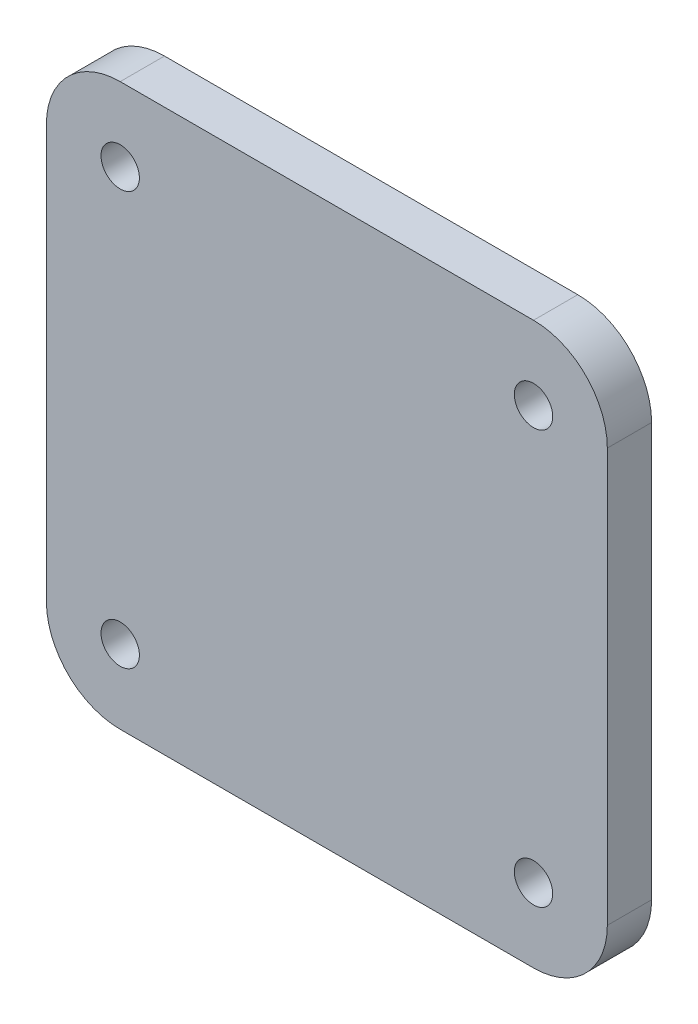
ISO-10303-21;
HEADER;
FILE_DESCRIPTION(('STEP AP214'),'2;1');
FILE_NAME('part.step','',(''),(''),'','','');
FILE_SCHEMA(('AUTOMOTIVE_DESIGN { 1 0 10303 214 1 1 1 1 }'));
ENDSEC;
DATA;
#1=APPLICATION_CONTEXT('core data for automotive mechanical design processes');
#2=APPLICATION_PROTOCOL_DEFINITION('international standard','automotive_design',2000,#1);
#3=PRODUCT_CONTEXT('',#1,'mechanical');
#4=PRODUCT('Part','Part','',(#3));
#5=PRODUCT_RELATED_PRODUCT_CATEGORY('part','',(#4));
#6=PRODUCT_DEFINITION_FORMATION('','',#4);
#7=PRODUCT_DEFINITION_CONTEXT('part definition',#1,'design');
#8=PRODUCT_DEFINITION('design','',#6,#7);
#9=PRODUCT_DEFINITION_SHAPE('','',#8);
#10=(LENGTH_UNIT() NAMED_UNIT(*) SI_UNIT(.MILLI.,.METRE.));
#11=(NAMED_UNIT(*) PLANE_ANGLE_UNIT() SI_UNIT($,.RADIAN.));
#12=(NAMED_UNIT(*) SI_UNIT($,.STERADIAN.) SOLID_ANGLE_UNIT());
#13=UNCERTAINTY_MEASURE_WITH_UNIT(LENGTH_MEASURE(1.E-05),#10,'distance_accuracy_value','');
#14=(GEOMETRIC_REPRESENTATION_CONTEXT(3) GLOBAL_UNCERTAINTY_ASSIGNED_CONTEXT((#13)) GLOBAL_UNIT_ASSIGNED_CONTEXT((#10,
#11,#12)) REPRESENTATION_CONTEXT('',''));
#15=CARTESIAN_POINT('',(0.,0.,0.));
#16=DIRECTION('',(0.,0.,1.));
#17=DIRECTION('',(1.,0.,0.));
#18=AXIS2_PLACEMENT_3D('',#15,#16,#17);
#19=CARTESIAN_POINT('',(0.,0.,3.));
#20=DIRECTION('',(0.,0.,1.));
#21=DIRECTION('',(1.,0.,0.));
#22=AXIS2_PLACEMENT_3D('',#19,#20,#21);
#23=PLANE('',#22);
#24=CARTESIAN_POINT('',(14.,14.,3.));
#25=DIRECTION('',(0.,0.,1.));
#26=DIRECTION('',(1.,0.,0.));
#27=AXIS2_PLACEMENT_3D('',#24,#25,#26);
#28=CIRCLE('',#27,1.3);
#29=CARTESIAN_POINT('',(15.3,14.,3.));
#30=VERTEX_POINT('',#29);
#31=EDGE_CURVE('E188',#30,#30,#28,.T.);
#32=ORIENTED_EDGE('',*,*,#31,.F.);
#33=EDGE_LOOP('',(#32));
#34=FACE_BOUND('',#33,.T.);
#35=CARTESIAN_POINT('',(-14.,-14.,3.));
#36=DIRECTION('',(0.,0.,1.));
#37=DIRECTION('',(1.,0.,0.));
#38=AXIS2_PLACEMENT_3D('',#35,#36,#37);
#39=CIRCLE('',#38,1.3);
#40=CARTESIAN_POINT('',(-12.7,-14.,3.));
#41=VERTEX_POINT('',#40);
#42=EDGE_CURVE('E129',#41,#41,#39,.T.);
#43=ORIENTED_EDGE('',*,*,#42,.F.);
#44=EDGE_LOOP('',(#43));
#45=FACE_BOUND('',#44,.T.);
#46=DIRECTION('',(1.,0.,0.));
#47=VECTOR('',#46,1.);
#48=CARTESIAN_POINT('',(-19.,-19.,3.));
#49=LINE('',#48,#47);
#50=CARTESIAN_POINT('',(-14.,-19.,3.));
#51=VERTEX_POINT('',#50);
#52=CARTESIAN_POINT('',(14.,-19.,3.));
#53=VERTEX_POINT('',#52);
#54=EDGE_CURVE('E138',#51,#53,#49,.T.);
#55=ORIENTED_EDGE('',*,*,#54,.T.);
#56=CARTESIAN_POINT('',(14.,-14.,3.));
#57=DIRECTION('',(0.,0.,1.));
#58=DIRECTION('',(1.,0.,0.));
#59=AXIS2_PLACEMENT_3D('',#56,#57,#58);
#60=CIRCLE('',#59,5.);
#61=CARTESIAN_POINT('',(19.,-14.,3.));
#62=VERTEX_POINT('',#61);
#63=EDGE_CURVE('E157',#53,#62,#60,.T.);
#64=ORIENTED_EDGE('',*,*,#63,.T.);
#65=DIRECTION('',(0.,1.,0.));
#66=VECTOR('',#65,1.);
#67=CARTESIAN_POINT('',(19.,19.,3.));
#68=LINE('',#67,#66);
#69=CARTESIAN_POINT('',(19.,14.,3.));
#70=VERTEX_POINT('',#69);
#71=EDGE_CURVE('E121',#62,#70,#68,.T.);
#72=ORIENTED_EDGE('',*,*,#71,.T.);
#73=CARTESIAN_POINT('',(14.,14.,3.));
#74=DIRECTION('',(0.,0.,1.));
#75=DIRECTION('',(1.,0.,0.));
#76=AXIS2_PLACEMENT_3D('',#73,#74,#75);
#77=CIRCLE('',#76,5.);
#78=CARTESIAN_POINT('',(14.,19.,3.));
#79=VERTEX_POINT('',#78);
#80=EDGE_CURVE('E152',#70,#79,#77,.T.);
#81=ORIENTED_EDGE('',*,*,#80,.T.);
#82=DIRECTION('',(-1.,0.,0.));
#83=VECTOR('',#82,1.);
#84=CARTESIAN_POINT('',(-19.,19.,3.));
#85=LINE('',#84,#83);
#86=CARTESIAN_POINT('',(-14.,19.,3.));
#87=VERTEX_POINT('',#86);
#88=EDGE_CURVE('E168',#79,#87,#85,.T.);
#89=ORIENTED_EDGE('',*,*,#88,.T.);
#90=CARTESIAN_POINT('',(-14.,14.,3.));
#91=DIRECTION('',(0.,0.,1.));
#92=DIRECTION('',(1.,0.,0.));
#93=AXIS2_PLACEMENT_3D('',#90,#91,#92);
#94=CIRCLE('',#93,5.);
#95=CARTESIAN_POINT('',(-19.,14.,3.));
#96=VERTEX_POINT('',#95);
#97=EDGE_CURVE('E57',#87,#96,#94,.T.);
#98=ORIENTED_EDGE('',*,*,#97,.T.);
#99=DIRECTION('',(0.,-1.,0.));
#100=VECTOR('',#99,1.);
#101=CARTESIAN_POINT('',(-19.,19.,3.));
#102=LINE('',#101,#100);
#103=CARTESIAN_POINT('',(-19.,-14.,3.));
#104=VERTEX_POINT('',#103);
#105=EDGE_CURVE('E176',#96,#104,#102,.T.);
#106=ORIENTED_EDGE('',*,*,#105,.T.);
#107=CARTESIAN_POINT('',(-14.,-14.,3.));
#108=DIRECTION('',(0.,0.,1.));
#109=DIRECTION('',(1.,0.,0.));
#110=AXIS2_PLACEMENT_3D('',#107,#108,#109);
#111=CIRCLE('',#110,5.);
#112=EDGE_CURVE('E155',#104,#51,#111,.T.);
#113=ORIENTED_EDGE('',*,*,#112,.T.);
#114=EDGE_LOOP('',(#55,#64,#72,#81,#89,#98,#106,#113));
#115=FACE_BOUND('',#114,.T.);
#116=CARTESIAN_POINT('',(14.,-14.,3.));
#117=DIRECTION('',(0.,0.,1.));
#118=DIRECTION('',(1.,0.,0.));
#119=AXIS2_PLACEMENT_3D('',#116,#117,#118);
#120=CIRCLE('',#119,1.3);
#121=CARTESIAN_POINT('',(15.3,-14.,3.));
#122=VERTEX_POINT('',#121);
#123=EDGE_CURVE('E183',#122,#122,#120,.T.);
#124=ORIENTED_EDGE('',*,*,#123,.F.);
#125=EDGE_LOOP('',(#124));
#126=FACE_BOUND('',#125,.T.);
#127=CARTESIAN_POINT('',(-14.,14.,3.));
#128=DIRECTION('',(0.,0.,1.));
#129=DIRECTION('',(1.,0.,0.));
#130=AXIS2_PLACEMENT_3D('',#127,#128,#129);
#131=CIRCLE('',#130,1.3);
#132=CARTESIAN_POINT('',(-12.7,14.,3.));
#133=VERTEX_POINT('',#132);
#134=EDGE_CURVE('E194',#133,#133,#131,.T.);
#135=ORIENTED_EDGE('',*,*,#134,.F.);
#136=EDGE_LOOP('',(#135));
#137=FACE_BOUND('',#136,.T.);
#138=ADVANCED_FACE('F35',(#34,#45,#115,#126,#137),#23,.T.);
#139=CARTESIAN_POINT('',(0.,0.,0.));
#140=DIRECTION('',(0.,0.,1.));
#141=DIRECTION('',(1.,0.,0.));
#142=AXIS2_PLACEMENT_3D('',#139,#140,#141);
#143=PLANE('',#142);
#144=DIRECTION('',(0.,1.,0.));
#145=VECTOR('',#144,1.);
#146=CARTESIAN_POINT('',(19.,19.,0.));
#147=LINE('',#146,#145);
#148=CARTESIAN_POINT('',(19.,-14.,0.));
#149=VERTEX_POINT('',#148);
#150=CARTESIAN_POINT('',(19.,14.,0.));
#151=VERTEX_POINT('',#150);
#152=EDGE_CURVE('E118',#149,#151,#147,.T.);
#153=ORIENTED_EDGE('',*,*,#152,.F.);
#154=CARTESIAN_POINT('',(14.,-14.,0.));
#155=DIRECTION('',(0.,0.,1.));
#156=DIRECTION('',(1.,0.,0.));
#157=AXIS2_PLACEMENT_3D('',#154,#155,#156);
#158=CIRCLE('',#157,5.);
#159=CARTESIAN_POINT('',(14.,-19.,0.));
#160=VERTEX_POINT('',#159);
#161=EDGE_CURVE('E101',#149,#160,#158,.F.);
#162=ORIENTED_EDGE('',*,*,#161,.T.);
#163=DIRECTION('',(1.,0.,0.));
#164=VECTOR('',#163,1.);
#165=CARTESIAN_POINT('',(-19.,-19.,0.));
#166=LINE('',#165,#164);
#167=CARTESIAN_POINT('',(-14.,-19.,0.));
#168=VERTEX_POINT('',#167);
#169=EDGE_CURVE('E142',#168,#160,#166,.T.);
#170=ORIENTED_EDGE('',*,*,#169,.F.);
#171=CARTESIAN_POINT('',(-14.,-14.,0.));
#172=DIRECTION('',(0.,0.,1.));
#173=DIRECTION('',(1.,0.,0.));
#174=AXIS2_PLACEMENT_3D('',#171,#172,#173);
#175=CIRCLE('',#174,5.);
#176=CARTESIAN_POINT('',(-19.,-14.,0.));
#177=VERTEX_POINT('',#176);
#178=EDGE_CURVE('E112',#168,#177,#175,.F.);
#179=ORIENTED_EDGE('',*,*,#178,.T.);
#180=DIRECTION('',(0.,-1.,0.));
#181=VECTOR('',#180,1.);
#182=CARTESIAN_POINT('',(-19.,19.,0.));
#183=LINE('',#182,#181);
#184=CARTESIAN_POINT('',(-19.,14.,0.));
#185=VERTEX_POINT('',#184);
#186=EDGE_CURVE('E132',#185,#177,#183,.T.);
#187=ORIENTED_EDGE('',*,*,#186,.F.);
#188=CARTESIAN_POINT('',(-14.,14.,0.));
#189=DIRECTION('',(0.,0.,1.));
#190=DIRECTION('',(1.,0.,0.));
#191=AXIS2_PLACEMENT_3D('',#188,#189,#190);
#192=CIRCLE('',#191,5.);
#193=CARTESIAN_POINT('',(-14.,19.,0.));
#194=VERTEX_POINT('',#193);
#195=EDGE_CURVE('E146',#185,#194,#192,.F.);
#196=ORIENTED_EDGE('',*,*,#195,.T.);
#197=DIRECTION('',(-1.,0.,0.));
#198=VECTOR('',#197,1.);
#199=CARTESIAN_POINT('',(-19.,19.,0.));
#200=LINE('',#199,#198);
#201=CARTESIAN_POINT('',(14.,19.,0.));
#202=VERTEX_POINT('',#201);
#203=EDGE_CURVE('E128',#202,#194,#200,.T.);
#204=ORIENTED_EDGE('',*,*,#203,.F.);
#205=CARTESIAN_POINT('',(14.,14.,0.));
#206=DIRECTION('',(0.,0.,1.));
#207=DIRECTION('',(1.,0.,0.));
#208=AXIS2_PLACEMENT_3D('',#205,#206,#207);
#209=CIRCLE('',#208,5.);
#210=EDGE_CURVE('E122',#202,#151,#209,.F.);
#211=ORIENTED_EDGE('',*,*,#210,.T.);
#212=EDGE_LOOP('',(#153,#162,#170,#179,#187,#196,#204,#211));
#213=FACE_BOUND('',#212,.T.);
#214=CARTESIAN_POINT('',(-14.,-14.,0.));
#215=DIRECTION('',(0.,0.,1.));
#216=DIRECTION('',(1.,0.,0.));
#217=AXIS2_PLACEMENT_3D('',#214,#215,#216);
#218=CIRCLE('',#217,1.3);
#219=CARTESIAN_POINT('',(-12.7,-14.,0.));
#220=VERTEX_POINT('',#219);
#221=EDGE_CURVE('E135',#220,#220,#218,.T.);
#222=ORIENTED_EDGE('',*,*,#221,.T.);
#223=EDGE_LOOP('',(#222));
#224=FACE_BOUND('',#223,.T.);
#225=CARTESIAN_POINT('',(14.,-14.,0.));
#226=DIRECTION('',(0.,0.,1.));
#227=DIRECTION('',(1.,0.,0.));
#228=AXIS2_PLACEMENT_3D('',#225,#226,#227);
#229=CIRCLE('',#228,1.3);
#230=CARTESIAN_POINT('',(15.3,-14.,0.));
#231=VERTEX_POINT('',#230);
#232=EDGE_CURVE('E185',#231,#231,#229,.T.);
#233=ORIENTED_EDGE('',*,*,#232,.T.);
#234=EDGE_LOOP('',(#233));
#235=FACE_BOUND('',#234,.T.);
#236=CARTESIAN_POINT('',(14.,14.,0.));
#237=DIRECTION('',(0.,0.,1.));
#238=DIRECTION('',(1.,0.,0.));
#239=AXIS2_PLACEMENT_3D('',#236,#237,#238);
#240=CIRCLE('',#239,1.3);
#241=CARTESIAN_POINT('',(15.3,14.,0.));
#242=VERTEX_POINT('',#241);
#243=EDGE_CURVE('E191',#242,#242,#240,.T.);
#244=ORIENTED_EDGE('',*,*,#243,.T.);
#245=EDGE_LOOP('',(#244));
#246=FACE_BOUND('',#245,.T.);
#247=CARTESIAN_POINT('',(-14.,14.,0.));
#248=DIRECTION('',(0.,0.,1.));
#249=DIRECTION('',(1.,0.,0.));
#250=AXIS2_PLACEMENT_3D('',#247,#248,#249);
#251=CIRCLE('',#250,1.3);
#252=CARTESIAN_POINT('',(-12.7,14.,0.));
#253=VERTEX_POINT('',#252);
#254=EDGE_CURVE('E197',#253,#253,#251,.T.);
#255=ORIENTED_EDGE('',*,*,#254,.T.);
#256=EDGE_LOOP('',(#255));
#257=FACE_BOUND('',#256,.T.);
#258=ADVANCED_FACE('F125',(#213,#224,#235,#246,#257),#143,.F.);
#259=CARTESIAN_POINT('',(19.,19.,3.));
#260=DIRECTION('',(-1.,0.,0.));
#261=DIRECTION('',(0.,0.,1.));
#262=AXIS2_PLACEMENT_3D('',#259,#260,#261);
#263=PLANE('',#262);
#264=ORIENTED_EDGE('',*,*,#71,.F.);
#265=DIRECTION('',(0.,0.,-1.));
#266=VECTOR('',#265,1.);
#267=CARTESIAN_POINT('',(19.,-14.,3.));
#268=LINE('',#267,#266);
#269=EDGE_CURVE('E105',#62,#149,#268,.T.);
#270=ORIENTED_EDGE('',*,*,#269,.T.);
#271=ORIENTED_EDGE('',*,*,#152,.T.);
#272=DIRECTION('',(0.,0.,-1.));
#273=VECTOR('',#272,1.);
#274=CARTESIAN_POINT('',(19.,14.,3.));
#275=LINE('',#274,#273);
#276=EDGE_CURVE('E123',#151,#70,#275,.F.);
#277=ORIENTED_EDGE('',*,*,#276,.T.);
#278=EDGE_LOOP('',(#264,#270,#271,#277));
#279=FACE_BOUND('',#278,.T.);
#280=ADVANCED_FACE('F117',(#279),#263,.F.);
#281=CARTESIAN_POINT('',(-19.,19.,3.));
#282=DIRECTION('',(0.,-1.,0.));
#283=DIRECTION('',(0.,0.,-1.));
#284=AXIS2_PLACEMENT_3D('',#281,#282,#283);
#285=PLANE('',#284);
#286=ORIENTED_EDGE('',*,*,#203,.T.);
#287=DIRECTION('',(0.,0.,-1.));
#288=VECTOR('',#287,1.);
#289=CARTESIAN_POINT('',(-14.,19.,3.));
#290=LINE('',#289,#288);
#291=EDGE_CURVE('E11',#194,#87,#290,.F.);
#292=ORIENTED_EDGE('',*,*,#291,.T.);
#293=ORIENTED_EDGE('',*,*,#88,.F.);
#294=DIRECTION('',(0.,0.,-1.));
#295=VECTOR('',#294,1.);
#296=CARTESIAN_POINT('',(14.,19.,3.));
#297=LINE('',#296,#295);
#298=EDGE_CURVE('E43',#79,#202,#297,.T.);
#299=ORIENTED_EDGE('',*,*,#298,.T.);
#300=EDGE_LOOP('',(#286,#292,#293,#299));
#301=FACE_BOUND('',#300,.T.);
#302=ADVANCED_FACE('F166',(#301),#285,.F.);
#303=CARTESIAN_POINT('',(-19.,19.,3.));
#304=DIRECTION('',(1.,0.,0.));
#305=DIRECTION('',(0.,0.,-1.));
#306=AXIS2_PLACEMENT_3D('',#303,#304,#305);
#307=PLANE('',#306);
#308=ORIENTED_EDGE('',*,*,#186,.T.);
#309=DIRECTION('',(0.,0.,-1.));
#310=VECTOR('',#309,1.);
#311=CARTESIAN_POINT('',(-19.,-14.,3.));
#312=LINE('',#311,#310);
#313=EDGE_CURVE('E50',#177,#104,#312,.F.);
#314=ORIENTED_EDGE('',*,*,#313,.T.);
#315=ORIENTED_EDGE('',*,*,#105,.F.);
#316=DIRECTION('',(0.,0.,-1.));
#317=VECTOR('',#316,1.);
#318=CARTESIAN_POINT('',(-19.,14.,3.));
#319=LINE('',#318,#317);
#320=EDGE_CURVE('E159',#96,#185,#319,.T.);
#321=ORIENTED_EDGE('',*,*,#320,.T.);
#322=EDGE_LOOP('',(#308,#314,#315,#321));
#323=FACE_BOUND('',#322,.T.);
#324=ADVANCED_FACE('F175',(#323),#307,.F.);
#325=CARTESIAN_POINT('',(-19.,-19.,3.));
#326=DIRECTION('',(0.,1.,0.));
#327=DIRECTION('',(0.,0.,1.));
#328=AXIS2_PLACEMENT_3D('',#325,#326,#327);
#329=PLANE('',#328);
#330=ORIENTED_EDGE('',*,*,#169,.T.);
#331=DIRECTION('',(0.,0.,-1.));
#332=VECTOR('',#331,1.);
#333=CARTESIAN_POINT('',(14.,-19.,3.));
#334=LINE('',#333,#332);
#335=EDGE_CURVE('E106',#160,#53,#334,.F.);
#336=ORIENTED_EDGE('',*,*,#335,.T.);
#337=ORIENTED_EDGE('',*,*,#54,.F.);
#338=DIRECTION('',(0.,0.,-1.));
#339=VECTOR('',#338,1.);
#340=CARTESIAN_POINT('',(-14.,-19.,3.));
#341=LINE('',#340,#339);
#342=EDGE_CURVE('E111',#51,#168,#341,.T.);
#343=ORIENTED_EDGE('',*,*,#342,.T.);
#344=EDGE_LOOP('',(#330,#336,#337,#343));
#345=FACE_BOUND('',#344,.T.);
#346=ADVANCED_FACE('F219',(#345),#329,.F.);
#347=CARTESIAN_POINT('',(-14.,-14.,3.));
#348=DIRECTION('',(0.,0.,-1.));
#349=DIRECTION('',(-1.,0.,0.));
#350=AXIS2_PLACEMENT_3D('',#347,#348,#349);
#351=CYLINDRICAL_SURFACE('',#350,1.3);
#352=ORIENTED_EDGE('',*,*,#42,.T.);
#353=EDGE_LOOP('',(#352));
#354=FACE_BOUND('',#353,.T.);
#355=ORIENTED_EDGE('',*,*,#221,.F.);
#356=EDGE_LOOP('',(#355));
#357=FACE_BOUND('',#356,.T.);
#358=ADVANCED_FACE('F216',(#354,#357),#351,.F.);
#359=CARTESIAN_POINT('',(14.,-14.,3.));
#360=DIRECTION('',(0.,0.,-1.));
#361=DIRECTION('',(-1.,0.,0.));
#362=AXIS2_PLACEMENT_3D('',#359,#360,#361);
#363=CYLINDRICAL_SURFACE('',#362,1.3);
#364=ORIENTED_EDGE('',*,*,#123,.T.);
#365=EDGE_LOOP('',(#364));
#366=FACE_BOUND('',#365,.T.);
#367=ORIENTED_EDGE('',*,*,#232,.F.);
#368=EDGE_LOOP('',(#367));
#369=FACE_BOUND('',#368,.T.);
#370=ADVANCED_FACE('F245',(#366,#369),#363,.F.);
#371=CARTESIAN_POINT('',(14.,14.,3.));
#372=DIRECTION('',(0.,0.,-1.));
#373=DIRECTION('',(-1.,0.,0.));
#374=AXIS2_PLACEMENT_3D('',#371,#372,#373);
#375=CYLINDRICAL_SURFACE('',#374,1.3);
#376=ORIENTED_EDGE('',*,*,#31,.T.);
#377=EDGE_LOOP('',(#376));
#378=FACE_BOUND('',#377,.T.);
#379=ORIENTED_EDGE('',*,*,#243,.F.);
#380=EDGE_LOOP('',(#379));
#381=FACE_BOUND('',#380,.T.);
#382=ADVANCED_FACE('F248',(#378,#381),#375,.F.);
#383=CARTESIAN_POINT('',(-14.,14.,3.));
#384=DIRECTION('',(0.,0.,-1.));
#385=DIRECTION('',(-1.,0.,0.));
#386=AXIS2_PLACEMENT_3D('',#383,#384,#385);
#387=CYLINDRICAL_SURFACE('',#386,1.3);
#388=ORIENTED_EDGE('',*,*,#134,.T.);
#389=EDGE_LOOP('',(#388));
#390=FACE_BOUND('',#389,.T.);
#391=ORIENTED_EDGE('',*,*,#254,.F.);
#392=EDGE_LOOP('',(#391));
#393=FACE_BOUND('',#392,.T.);
#394=ADVANCED_FACE('F203',(#390,#393),#387,.F.);
#395=CARTESIAN_POINT('',(14.,-14.,3.));
#396=DIRECTION('',(0.,0.,-1.));
#397=DIRECTION('',(-1.,0.,0.));
#398=AXIS2_PLACEMENT_3D('',#395,#396,#397);
#399=CYLINDRICAL_SURFACE('',#398,5.);
#400=ORIENTED_EDGE('',*,*,#63,.F.);
#401=ORIENTED_EDGE('',*,*,#335,.F.);
#402=ORIENTED_EDGE('',*,*,#161,.F.);
#403=ORIENTED_EDGE('',*,*,#269,.F.);
#404=EDGE_LOOP('',(#400,#401,#402,#403));
#405=FACE_BOUND('',#404,.T.);
#406=ADVANCED_FACE('F104',(#405),#399,.T.);
#407=CARTESIAN_POINT('',(-14.,-14.,3.));
#408=DIRECTION('',(0.,0.,-1.));
#409=DIRECTION('',(-1.,0.,0.));
#410=AXIS2_PLACEMENT_3D('',#407,#408,#409);
#411=CYLINDRICAL_SURFACE('',#410,5.);
#412=ORIENTED_EDGE('',*,*,#112,.F.);
#413=ORIENTED_EDGE('',*,*,#313,.F.);
#414=ORIENTED_EDGE('',*,*,#178,.F.);
#415=ORIENTED_EDGE('',*,*,#342,.F.);
#416=EDGE_LOOP('',(#412,#413,#414,#415));
#417=FACE_BOUND('',#416,.T.);
#418=ADVANCED_FACE('F231',(#417),#411,.T.);
#419=CARTESIAN_POINT('',(-14.,14.,3.));
#420=DIRECTION('',(0.,0.,-1.));
#421=DIRECTION('',(-1.,0.,0.));
#422=AXIS2_PLACEMENT_3D('',#419,#420,#421);
#423=CYLINDRICAL_SURFACE('',#422,5.);
#424=ORIENTED_EDGE('',*,*,#97,.F.);
#425=ORIENTED_EDGE('',*,*,#291,.F.);
#426=ORIENTED_EDGE('',*,*,#195,.F.);
#427=ORIENTED_EDGE('',*,*,#320,.F.);
#428=EDGE_LOOP('',(#424,#425,#426,#427));
#429=FACE_BOUND('',#428,.T.);
#430=ADVANCED_FACE('F174',(#429),#423,.T.);
#431=CARTESIAN_POINT('',(14.,14.,3.));
#432=DIRECTION('',(0.,0.,-1.));
#433=DIRECTION('',(-1.,0.,0.));
#434=AXIS2_PLACEMENT_3D('',#431,#432,#433);
#435=CYLINDRICAL_SURFACE('',#434,5.);
#436=ORIENTED_EDGE('',*,*,#80,.F.);
#437=ORIENTED_EDGE('',*,*,#276,.F.);
#438=ORIENTED_EDGE('',*,*,#210,.F.);
#439=ORIENTED_EDGE('',*,*,#298,.F.);
#440=EDGE_LOOP('',(#436,#437,#438,#439));
#441=FACE_BOUND('',#440,.T.);
#442=ADVANCED_FACE('F37',(#441),#435,.T.);
#443=CLOSED_SHELL('',(#138,#258,#280,#302,#324,#346,#358,#370,#382,#394,#406,#418,#430,#442));
#444=MANIFOLD_SOLID_BREP('B2',#443);
#445=ADVANCED_BREP_SHAPE_REPRESENTATION('',(#18,#444),#14);
#446=SHAPE_DEFINITION_REPRESENTATION(#9,#445);
ENDSEC;
END-ISO-10303-21;
